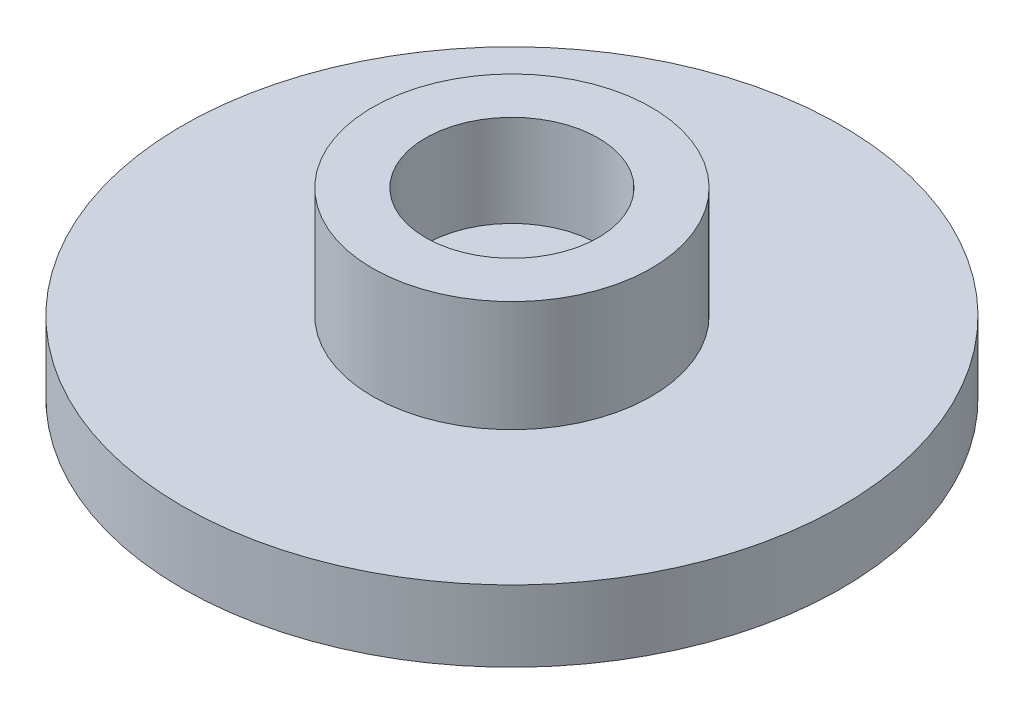
ISO-10303-21;
HEADER;
FILE_DESCRIPTION(('STEP AP214'),'2;1');
FILE_NAME('part.step','',(''),(''),'','','');
FILE_SCHEMA(('AUTOMOTIVE_DESIGN { 1 0 10303 214 1 1 1 1 }'));
ENDSEC;
DATA;
#1=APPLICATION_CONTEXT('core data for automotive mechanical design processes');
#2=APPLICATION_PROTOCOL_DEFINITION('international standard','automotive_design',2000,#1);
#3=PRODUCT_CONTEXT('',#1,'mechanical');
#4=PRODUCT('Part','Part','',(#3));
#5=PRODUCT_RELATED_PRODUCT_CATEGORY('part','',(#4));
#6=PRODUCT_DEFINITION_FORMATION('','',#4);
#7=PRODUCT_DEFINITION_CONTEXT('part definition',#1,'design');
#8=PRODUCT_DEFINITION('design','',#6,#7);
#9=PRODUCT_DEFINITION_SHAPE('','',#8);
#10=(LENGTH_UNIT() NAMED_UNIT(*) SI_UNIT(.MILLI.,.METRE.));
#11=(NAMED_UNIT(*) PLANE_ANGLE_UNIT() SI_UNIT($,.RADIAN.));
#12=(NAMED_UNIT(*) SI_UNIT($,.STERADIAN.) SOLID_ANGLE_UNIT());
#13=UNCERTAINTY_MEASURE_WITH_UNIT(LENGTH_MEASURE(1.E-05),#10,'distance_accuracy_value','');
#14=(GEOMETRIC_REPRESENTATION_CONTEXT(3) GLOBAL_UNCERTAINTY_ASSIGNED_CONTEXT((#13)) GLOBAL_UNIT_ASSIGNED_CONTEXT((#10,
#11,#12)) REPRESENTATION_CONTEXT('',''));
#15=CARTESIAN_POINT('',(0.,0.,0.));
#16=DIRECTION('',(0.,0.,1.));
#17=DIRECTION('',(1.,0.,0.));
#18=AXIS2_PLACEMENT_3D('',#15,#16,#17);
#19=CARTESIAN_POINT('',(0.,2.25,0.));
#20=DIRECTION('',(0.,-1.,0.));
#21=DIRECTION('',(0.,0.,-1.));
#22=AXIS2_PLACEMENT_3D('',#19,#20,#21);
#23=CYLINDRICAL_SURFACE('',#22,10.4);
#24=CARTESIAN_POINT('',(0.,2.25,0.));
#25=DIRECTION('',(0.,1.,0.));
#26=DIRECTION('',(0.,0.,1.));
#27=AXIS2_PLACEMENT_3D('',#24,#25,#26);
#28=CIRCLE('',#27,10.4);
#29=CARTESIAN_POINT('',(0.,2.25,10.4));
#30=VERTEX_POINT('',#29);
#31=EDGE_CURVE('E45',#30,#30,#28,.T.);
#32=ORIENTED_EDGE('',*,*,#31,.F.);
#33=EDGE_LOOP('',(#32));
#34=FACE_BOUND('',#33,.T.);
#35=CARTESIAN_POINT('',(0.,0.,0.));
#36=DIRECTION('',(0.,1.,0.));
#37=DIRECTION('',(0.,0.,1.));
#38=AXIS2_PLACEMENT_3D('',#35,#36,#37);
#39=CIRCLE('',#38,10.4);
#40=CARTESIAN_POINT('',(0.,0.,10.4));
#41=VERTEX_POINT('',#40);
#42=EDGE_CURVE('E40',#41,#41,#39,.T.);
#43=ORIENTED_EDGE('',*,*,#42,.T.);
#44=EDGE_LOOP('',(#43));
#45=FACE_BOUND('',#44,.T.);
#46=ADVANCED_FACE('F37',(#34,#45),#23,.T.);
#47=CARTESIAN_POINT('',(0.,2.25,0.));
#48=DIRECTION('',(0.,1.,0.));
#49=DIRECTION('',(0.,0.,1.));
#50=AXIS2_PLACEMENT_3D('',#47,#48,#49);
#51=PLANE('',#50);
#52=CARTESIAN_POINT('',(0.,2.25,0.));
#53=DIRECTION('',(0.,1.,0.));
#54=DIRECTION('',(0.,0.,1.));
#55=AXIS2_PLACEMENT_3D('',#52,#53,#54);
#56=CIRCLE('',#55,4.4);
#57=CARTESIAN_POINT('',(0.,2.25,4.4));
#58=VERTEX_POINT('',#57);
#59=EDGE_CURVE('E10',#58,#58,#56,.T.);
#60=ORIENTED_EDGE('',*,*,#59,.F.);
#61=EDGE_LOOP('',(#60));
#62=FACE_BOUND('',#61,.T.);
#63=ORIENTED_EDGE('',*,*,#31,.T.);
#64=EDGE_LOOP('',(#63));
#65=FACE_BOUND('',#64,.T.);
#66=ADVANCED_FACE('F86',(#62,#65),#51,.T.);
#67=CARTESIAN_POINT('',(0.,0.,0.));
#68=DIRECTION('',(0.,1.,0.));
#69=DIRECTION('',(0.,0.,1.));
#70=AXIS2_PLACEMENT_3D('',#67,#68,#69);
#71=PLANE('',#70);
#72=ORIENTED_EDGE('',*,*,#42,.F.);
#73=EDGE_LOOP('',(#72));
#74=FACE_BOUND('',#73,.T.);
#75=ADVANCED_FACE('F81',(#74),#71,.F.);
#76=CARTESIAN_POINT('',(0.,5.75,0.));
#77=DIRECTION('',(0.,-1.,0.));
#78=DIRECTION('',(0.,0.,-1.));
#79=AXIS2_PLACEMENT_3D('',#76,#77,#78);
#80=CYLINDRICAL_SURFACE('',#79,4.4);
#81=CARTESIAN_POINT('',(0.,5.75,0.));
#82=DIRECTION('',(0.,1.,0.));
#83=DIRECTION('',(0.,0.,1.));
#84=AXIS2_PLACEMENT_3D('',#81,#82,#83);
#85=CIRCLE('',#84,4.4);
#86=CARTESIAN_POINT('',(0.,5.75,4.4));
#87=VERTEX_POINT('',#86);
#88=EDGE_CURVE('E52',#87,#87,#85,.T.);
#89=ORIENTED_EDGE('',*,*,#88,.F.);
#90=EDGE_LOOP('',(#89));
#91=FACE_BOUND('',#90,.T.);
#92=ORIENTED_EDGE('',*,*,#59,.T.);
#93=EDGE_LOOP('',(#92));
#94=FACE_BOUND('',#93,.T.);
#95=ADVANCED_FACE('F76',(#91,#94),#80,.T.);
#96=CARTESIAN_POINT('',(0.,5.75,0.));
#97=DIRECTION('',(0.,1.,0.));
#98=DIRECTION('',(0.,0.,1.));
#99=AXIS2_PLACEMENT_3D('',#96,#97,#98);
#100=PLANE('',#99);
#101=CARTESIAN_POINT('',(0.,5.75,0.));
#102=DIRECTION('',(0.,1.,0.));
#103=DIRECTION('',(0.,0.,1.));
#104=AXIS2_PLACEMENT_3D('',#101,#102,#103);
#105=CIRCLE('',#104,2.725);
#106=CARTESIAN_POINT('',(0.,5.75,2.725));
#107=VERTEX_POINT('',#106);
#108=EDGE_CURVE('E57',#107,#107,#105,.T.);
#109=ORIENTED_EDGE('',*,*,#108,.F.);
#110=EDGE_LOOP('',(#109));
#111=FACE_BOUND('',#110,.T.);
#112=ORIENTED_EDGE('',*,*,#88,.T.);
#113=EDGE_LOOP('',(#112));
#114=FACE_BOUND('',#113,.T.);
#115=ADVANCED_FACE('F70',(#111,#114),#100,.T.);
#116=CARTESIAN_POINT('',(0.,2.85,0.));
#117=DIRECTION('',(0.,1.,0.));
#118=DIRECTION('',(0.,0.,1.));
#119=AXIS2_PLACEMENT_3D('',#116,#117,#118);
#120=CYLINDRICAL_SURFACE('',#119,2.725);
#121=CARTESIAN_POINT('',(0.,2.85,0.));
#122=DIRECTION('',(0.,1.,0.));
#123=DIRECTION('',(0.,0.,1.));
#124=AXIS2_PLACEMENT_3D('',#121,#122,#123);
#125=CIRCLE('',#124,2.725);
#126=CARTESIAN_POINT('',(0.,2.85,2.725));
#127=VERTEX_POINT('',#126);
#128=EDGE_CURVE('E56',#127,#127,#125,.T.);
#129=ORIENTED_EDGE('',*,*,#128,.F.);
#130=EDGE_LOOP('',(#129));
#131=FACE_BOUND('',#130,.T.);
#132=ORIENTED_EDGE('',*,*,#108,.T.);
#133=EDGE_LOOP('',(#132));
#134=FACE_BOUND('',#133,.T.);
#135=ADVANCED_FACE('F67',(#131,#134),#120,.F.);
#136=CARTESIAN_POINT('',(0.,2.85,0.));
#137=DIRECTION('',(0.,1.,0.));
#138=DIRECTION('',(0.,0.,1.));
#139=AXIS2_PLACEMENT_3D('',#136,#137,#138);
#140=PLANE('',#139);
#141=ORIENTED_EDGE('',*,*,#128,.T.);
#142=EDGE_LOOP('',(#141));
#143=FACE_BOUND('',#142,.T.);
#144=ADVANCED_FACE('F65',(#143),#140,.T.);
#145=CLOSED_SHELL('',(#46,#66,#75,#95,#115,#135,#144));
#146=MANIFOLD_SOLID_BREP('B2',#145);
#147=ADVANCED_BREP_SHAPE_REPRESENTATION('',(#18,#146),#14);
#148=SHAPE_DEFINITION_REPRESENTATION(#9,#147);
ENDSEC;
END-ISO-10303-21;
